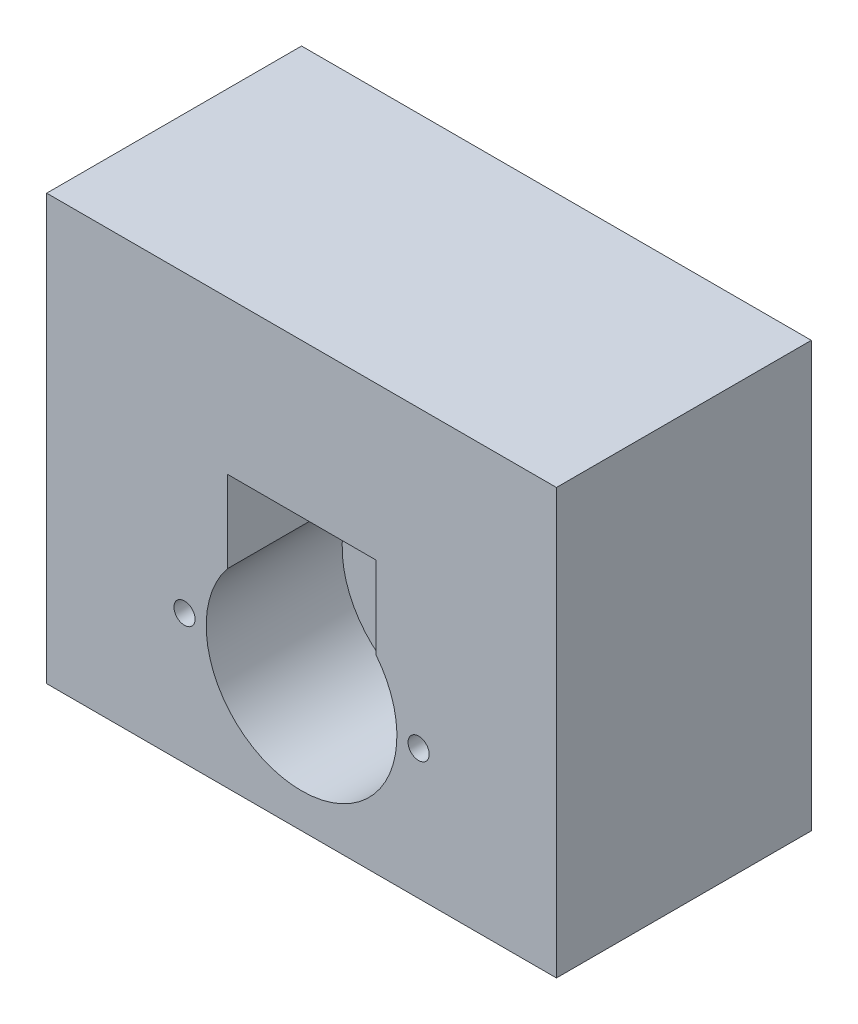
ISO-10303-21;
HEADER;
FILE_DESCRIPTION(('STEP AP214'),'2;1');
FILE_NAME('part.step','',(''),(''),'','','');
FILE_SCHEMA(('AUTOMOTIVE_DESIGN { 1 0 10303 214 1 1 1 1 }'));
ENDSEC;
DATA;
#1=APPLICATION_CONTEXT('core data for automotive mechanical design processes');
#2=APPLICATION_PROTOCOL_DEFINITION('international standard','automotive_design',2000,#1);
#3=PRODUCT_CONTEXT('',#1,'mechanical');
#4=PRODUCT('Part','Part','',(#3));
#5=PRODUCT_RELATED_PRODUCT_CATEGORY('part','',(#4));
#6=PRODUCT_DEFINITION_FORMATION('','',#4);
#7=PRODUCT_DEFINITION_CONTEXT('part definition',#1,'design');
#8=PRODUCT_DEFINITION('design','',#6,#7);
#9=PRODUCT_DEFINITION_SHAPE('','',#8);
#10=(LENGTH_UNIT() NAMED_UNIT(*) SI_UNIT(.MILLI.,.METRE.));
#11=(NAMED_UNIT(*) PLANE_ANGLE_UNIT() SI_UNIT($,.RADIAN.));
#12=(NAMED_UNIT(*) SI_UNIT($,.STERADIAN.) SOLID_ANGLE_UNIT());
#13=UNCERTAINTY_MEASURE_WITH_UNIT(LENGTH_MEASURE(1.E-05),#10,'distance_accuracy_value','');
#14=(GEOMETRIC_REPRESENTATION_CONTEXT(3) GLOBAL_UNCERTAINTY_ASSIGNED_CONTEXT((#13)) GLOBAL_UNIT_ASSIGNED_CONTEXT((#10,
#11,#12)) REPRESENTATION_CONTEXT('',''));
#15=CARTESIAN_POINT('',(0.,0.,0.));
#16=DIRECTION('',(0.,0.,1.));
#17=DIRECTION('',(1.,0.,0.));
#18=AXIS2_PLACEMENT_3D('',#15,#16,#17);
#19=CARTESIAN_POINT('',(0.,0.,38.1));
#20=DIRECTION('',(0.,0.,1.));
#21=DIRECTION('',(1.,0.,0.));
#22=AXIS2_PLACEMENT_3D('',#19,#20,#21);
#23=PLANE('',#22);
#24=CARTESIAN_POINT('',(17.5000000000005,-12.3156200112198,38.1));
#25=DIRECTION('',(0.,0.,1.));
#26=DIRECTION('',(1.,0.,0.));
#27=AXIS2_PLACEMENT_3D('',#24,#25,#26);
#28=CIRCLE('',#27,1.57999999999947);
#29=CARTESIAN_POINT('',(19.0799999999999,-12.3156200112198,38.1));
#30=VERTEX_POINT('',#29);
#31=EDGE_CURVE('E225',#30,#30,#28,.T.);
#32=ORIENTED_EDGE('',*,*,#31,.F.);
#33=EDGE_LOOP('',(#32));
#34=FACE_BOUND('',#33,.T.);
#35=CARTESIAN_POINT('',(-17.4999999999996,-12.3156200112198,38.1));
#36=DIRECTION('',(0.,0.,1.));
#37=DIRECTION('',(1.,0.,0.));
#38=AXIS2_PLACEMENT_3D('',#35,#36,#37);
#39=CIRCLE('',#38,1.57999999999947);
#40=CARTESIAN_POINT('',(-15.9200000000001,-12.3156200112198,38.1));
#41=VERTEX_POINT('',#40);
#42=EDGE_CURVE('E229',#41,#41,#39,.T.);
#43=ORIENTED_EDGE('',*,*,#42,.F.);
#44=EDGE_LOOP('',(#43));
#45=FACE_BOUND('',#44,.T.);
#46=DIRECTION('',(0.,-1.,0.));
#47=VECTOR('',#46,1.);
#48=CARTESIAN_POINT('',(-38.1,-31.75,38.1));
#49=LINE('',#48,#47);
#50=CARTESIAN_POINT('',(-38.1,31.75,38.1));
#51=VERTEX_POINT('',#50);
#52=CARTESIAN_POINT('',(-38.1,-31.75,38.1));
#53=VERTEX_POINT('',#52);
#54=EDGE_CURVE('E147',#51,#53,#49,.T.);
#55=ORIENTED_EDGE('',*,*,#54,.T.);
#56=DIRECTION('',(1.,0.,0.));
#57=VECTOR('',#56,1.);
#58=CARTESIAN_POINT('',(38.1,-31.75,38.1));
#59=LINE('',#58,#57);
#60=CARTESIAN_POINT('',(38.1,-31.75,38.1));
#61=VERTEX_POINT('',#60);
#62=EDGE_CURVE('E94',#53,#61,#59,.T.);
#63=ORIENTED_EDGE('',*,*,#62,.T.);
#64=DIRECTION('',(0.,1.,0.));
#65=VECTOR('',#64,1.);
#66=CARTESIAN_POINT('',(38.1,-31.75,38.1));
#67=LINE('',#66,#65);
#68=CARTESIAN_POINT('',(38.1,31.75,38.1));
#69=VERTEX_POINT('',#68);
#70=EDGE_CURVE('E150',#61,#69,#67,.T.);
#71=ORIENTED_EDGE('',*,*,#70,.T.);
#72=DIRECTION('',(-1.,0.,0.));
#73=VECTOR('',#72,1.);
#74=CARTESIAN_POINT('',(38.1,31.75,38.1));
#75=LINE('',#74,#73);
#76=EDGE_CURVE('E66',#69,#51,#75,.T.);
#77=ORIENTED_EDGE('',*,*,#76,.T.);
#78=EDGE_LOOP('',(#55,#63,#71,#77));
#79=FACE_BOUND('',#78,.T.);
#80=CARTESIAN_POINT('',(0.,-12.3156200112199,38.1));
#81=DIRECTION('',(0.,0.,1.));
#82=DIRECTION('',(1.,0.,0.));
#83=AXIS2_PLACEMENT_3D('',#80,#81,#82);
#84=CIRCLE('',#83,14.25399994);
#85=CARTESIAN_POINT('',(-11.0954170712053,-3.36753450059093,38.1));
#86=VERTEX_POINT('',#85);
#87=CARTESIAN_POINT('',(11.0954170712052,-3.36753450059093,38.1));
#88=VERTEX_POINT('',#87);
#89=EDGE_CURVE('E132',#86,#88,#84,.T.);
#90=ORIENTED_EDGE('',*,*,#89,.F.);
#91=DIRECTION('',(0.,1.,0.));
#92=VECTOR('',#91,1.);
#93=CARTESIAN_POINT('',(-11.0954170712053,-3.36753450059093,38.1));
#94=LINE('',#93,#92);
#95=CARTESIAN_POINT('',(-11.0954170712053,8.87092032554276,38.1));
#96=VERTEX_POINT('',#95);
#97=EDGE_CURVE('E57',#86,#96,#94,.T.);
#98=ORIENTED_EDGE('',*,*,#97,.T.);
#99=DIRECTION('',(1.,0.,0.));
#100=VECTOR('',#99,1.);
#101=CARTESIAN_POINT('',(-11.0954170712053,8.87092032554276,38.1));
#102=LINE('',#101,#100);
#103=CARTESIAN_POINT('',(11.0954170712052,8.87092032554276,38.1));
#104=VERTEX_POINT('',#103);
#105=EDGE_CURVE('E136',#96,#104,#102,.T.);
#106=ORIENTED_EDGE('',*,*,#105,.T.);
#107=DIRECTION('',(0.,1.,0.));
#108=VECTOR('',#107,1.);
#109=CARTESIAN_POINT('',(11.0954170712052,-3.36753450059093,38.1));
#110=LINE('',#109,#108);
#111=EDGE_CURVE('E241',#88,#104,#110,.T.);
#112=ORIENTED_EDGE('',*,*,#111,.F.);
#113=EDGE_LOOP('',(#90,#98,#106,#112));
#114=FACE_BOUND('',#113,.T.);
#115=ADVANCED_FACE('F42',(#34,#45,#79,#114),#23,.T.);
#116=CARTESIAN_POINT('',(-38.1,-31.75,38.1));
#117=DIRECTION('',(1.,0.,0.));
#118=DIRECTION('',(0.,0.,-1.));
#119=AXIS2_PLACEMENT_3D('',#116,#117,#118);
#120=PLANE('',#119);
#121=DIRECTION('',(0.,-1.,0.));
#122=VECTOR('',#121,1.);
#123=CARTESIAN_POINT('',(-38.1,-31.75,0.));
#124=LINE('',#123,#122);
#125=CARTESIAN_POINT('',(-38.1,31.75,0.));
#126=VERTEX_POINT('',#125);
#127=CARTESIAN_POINT('',(-38.1,-31.75,0.));
#128=VERTEX_POINT('',#127);
#129=EDGE_CURVE('E137',#126,#128,#124,.T.);
#130=ORIENTED_EDGE('',*,*,#129,.T.);
#131=DIRECTION('',(0.,0.,-1.));
#132=VECTOR('',#131,1.);
#133=CARTESIAN_POINT('',(-38.1,-31.75,38.1));
#134=LINE('',#133,#132);
#135=EDGE_CURVE('E11',#53,#128,#134,.T.);
#136=ORIENTED_EDGE('',*,*,#135,.F.);
#137=ORIENTED_EDGE('',*,*,#54,.F.);
#138=DIRECTION('',(0.,0.,-1.));
#139=VECTOR('',#138,1.);
#140=CARTESIAN_POINT('',(-38.1,31.75,38.1));
#141=LINE('',#140,#139);
#142=EDGE_CURVE('E152',#51,#126,#141,.T.);
#143=ORIENTED_EDGE('',*,*,#142,.T.);
#144=EDGE_LOOP('',(#130,#136,#137,#143));
#145=FACE_BOUND('',#144,.T.);
#146=ADVANCED_FACE('F44',(#145),#120,.F.);
#147=CARTESIAN_POINT('',(38.1,-31.75,38.1));
#148=DIRECTION('',(0.,1.,0.));
#149=DIRECTION('',(-1.,0.,0.));
#150=AXIS2_PLACEMENT_3D('',#147,#148,#149);
#151=PLANE('',#150);
#152=DIRECTION('',(1.,0.,0.));
#153=VECTOR('',#152,1.);
#154=CARTESIAN_POINT('',(38.1,-31.75,0.));
#155=LINE('',#154,#153);
#156=CARTESIAN_POINT('',(38.1,-31.75,0.));
#157=VERTEX_POINT('',#156);
#158=EDGE_CURVE('E141',#128,#157,#155,.T.);
#159=ORIENTED_EDGE('',*,*,#158,.T.);
#160=DIRECTION('',(0.,0.,-1.));
#161=VECTOR('',#160,1.);
#162=CARTESIAN_POINT('',(38.1,-31.75,38.1));
#163=LINE('',#162,#161);
#164=EDGE_CURVE('E50',#61,#157,#163,.T.);
#165=ORIENTED_EDGE('',*,*,#164,.F.);
#166=ORIENTED_EDGE('',*,*,#62,.F.);
#167=ORIENTED_EDGE('',*,*,#135,.T.);
#168=EDGE_LOOP('',(#159,#165,#166,#167));
#169=FACE_BOUND('',#168,.T.);
#170=ADVANCED_FACE('F180',(#169),#151,.F.);
#171=CARTESIAN_POINT('',(38.1,-31.75,38.1));
#172=DIRECTION('',(-1.,0.,0.));
#173=DIRECTION('',(0.,0.,1.));
#174=AXIS2_PLACEMENT_3D('',#171,#172,#173);
#175=PLANE('',#174);
#176=DIRECTION('',(0.,1.,0.));
#177=VECTOR('',#176,1.);
#178=CARTESIAN_POINT('',(38.1,-31.75,0.));
#179=LINE('',#178,#177);
#180=CARTESIAN_POINT('',(38.1,31.75,0.));
#181=VERTEX_POINT('',#180);
#182=EDGE_CURVE('E155',#157,#181,#179,.T.);
#183=ORIENTED_EDGE('',*,*,#182,.T.);
#184=DIRECTION('',(0.,0.,-1.));
#185=VECTOR('',#184,1.);
#186=CARTESIAN_POINT('',(38.1,31.75,38.1));
#187=LINE('',#186,#185);
#188=EDGE_CURVE('E159',#69,#181,#187,.T.);
#189=ORIENTED_EDGE('',*,*,#188,.F.);
#190=ORIENTED_EDGE('',*,*,#70,.F.);
#191=ORIENTED_EDGE('',*,*,#164,.T.);
#192=EDGE_LOOP('',(#183,#189,#190,#191));
#193=FACE_BOUND('',#192,.T.);
#194=ADVANCED_FACE('F164',(#193),#175,.F.);
#195=CARTESIAN_POINT('',(38.1,31.75,38.1));
#196=DIRECTION('',(0.,-1.,0.));
#197=DIRECTION('',(1.,0.,0.));
#198=AXIS2_PLACEMENT_3D('',#195,#196,#197);
#199=PLANE('',#198);
#200=DIRECTION('',(-1.,0.,0.));
#201=VECTOR('',#200,1.);
#202=CARTESIAN_POINT('',(38.1,31.75,0.));
#203=LINE('',#202,#201);
#204=EDGE_CURVE('E87',#181,#126,#203,.T.);
#205=ORIENTED_EDGE('',*,*,#204,.T.);
#206=ORIENTED_EDGE('',*,*,#142,.F.);
#207=ORIENTED_EDGE('',*,*,#76,.F.);
#208=ORIENTED_EDGE('',*,*,#188,.T.);
#209=EDGE_LOOP('',(#205,#206,#207,#208));
#210=FACE_BOUND('',#209,.T.);
#211=ADVANCED_FACE('F172',(#210),#199,.F.);
#212=CARTESIAN_POINT('',(0.,0.,0.));
#213=DIRECTION('',(0.,0.,1.));
#214=DIRECTION('',(1.,0.,0.));
#215=AXIS2_PLACEMENT_3D('',#212,#213,#214);
#216=PLANE('',#215);
#217=ORIENTED_EDGE('',*,*,#129,.F.);
#218=ORIENTED_EDGE('',*,*,#204,.F.);
#219=ORIENTED_EDGE('',*,*,#182,.F.);
#220=ORIENTED_EDGE('',*,*,#158,.F.);
#221=EDGE_LOOP('',(#217,#218,#219,#220));
#222=FACE_BOUND('',#221,.T.);
#223=ADVANCED_FACE('F168',(#222),#216,.F.);
#224=CARTESIAN_POINT('',(-11.0954170712053,-3.36753450059093,17.78));
#225=DIRECTION('',(1.,0.,0.));
#226=DIRECTION('',(0.,0.,-1.));
#227=AXIS2_PLACEMENT_3D('',#224,#225,#226);
#228=PLANE('',#227);
#229=ORIENTED_EDGE('',*,*,#97,.F.);
#230=DIRECTION('',(0.,0.,1.));
#231=VECTOR('',#230,1.);
#232=CARTESIAN_POINT('',(-11.0954170712053,-3.36753450059093,17.78));
#233=LINE('',#232,#231);
#234=CARTESIAN_POINT('',(-11.0954170712053,-3.36753450059093,17.78));
#235=VERTEX_POINT('',#234);
#236=EDGE_CURVE('E131',#235,#86,#233,.T.);
#237=ORIENTED_EDGE('',*,*,#236,.F.);
#238=DIRECTION('',(0.,1.,0.));
#239=VECTOR('',#238,1.);
#240=CARTESIAN_POINT('',(-11.0954170712053,-3.36753450059093,17.78));
#241=LINE('',#240,#239);
#242=CARTESIAN_POINT('',(-11.0954170712053,8.87092032554276,17.78));
#243=VERTEX_POINT('',#242);
#244=EDGE_CURVE('E121',#235,#243,#241,.T.);
#245=ORIENTED_EDGE('',*,*,#244,.T.);
#246=DIRECTION('',(0.,0.,1.));
#247=VECTOR('',#246,1.);
#248=CARTESIAN_POINT('',(-11.0954170712053,8.87092032554276,17.78));
#249=LINE('',#248,#247);
#250=EDGE_CURVE('E130',#243,#96,#249,.T.);
#251=ORIENTED_EDGE('',*,*,#250,.T.);
#252=EDGE_LOOP('',(#229,#237,#245,#251));
#253=FACE_BOUND('',#252,.T.);
#254=ADVANCED_FACE('F129',(#253),#228,.T.);
#255=CARTESIAN_POINT('',(-11.0954170712053,8.87092032554276,17.78));
#256=DIRECTION('',(0.,-1.,0.));
#257=DIRECTION('',(0.,0.,-1.));
#258=AXIS2_PLACEMENT_3D('',#255,#256,#257);
#259=PLANE('',#258);
#260=ORIENTED_EDGE('',*,*,#105,.F.);
#261=ORIENTED_EDGE('',*,*,#250,.F.);
#262=DIRECTION('',(1.,0.,0.));
#263=VECTOR('',#262,1.);
#264=CARTESIAN_POINT('',(-11.0954170712053,8.87092032554276,17.78));
#265=LINE('',#264,#263);
#266=CARTESIAN_POINT('',(11.0954170712052,8.87092032554276,17.78));
#267=VERTEX_POINT('',#266);
#268=EDGE_CURVE('E117',#243,#267,#265,.T.);
#269=ORIENTED_EDGE('',*,*,#268,.T.);
#270=DIRECTION('',(0.,0.,1.));
#271=VECTOR('',#270,1.);
#272=CARTESIAN_POINT('',(11.0954170712052,8.87092032554276,17.78));
#273=LINE('',#272,#271);
#274=EDGE_CURVE('E138',#267,#104,#273,.T.);
#275=ORIENTED_EDGE('',*,*,#274,.T.);
#276=EDGE_LOOP('',(#260,#261,#269,#275));
#277=FACE_BOUND('',#276,.T.);
#278=ADVANCED_FACE('F134',(#277),#259,.T.);
#279=CARTESIAN_POINT('',(11.0954170712052,-3.36753450059093,17.78));
#280=DIRECTION('',(1.,0.,0.));
#281=DIRECTION('',(0.,0.,-1.));
#282=AXIS2_PLACEMENT_3D('',#279,#280,#281);
#283=PLANE('',#282);
#284=ORIENTED_EDGE('',*,*,#111,.T.);
#285=ORIENTED_EDGE('',*,*,#274,.F.);
#286=DIRECTION('',(0.,1.,0.));
#287=VECTOR('',#286,1.);
#288=CARTESIAN_POINT('',(11.0954170712052,-3.36753450059093,17.78));
#289=LINE('',#288,#287);
#290=CARTESIAN_POINT('',(11.0954170712052,-3.36753450059093,17.78));
#291=VERTEX_POINT('',#290);
#292=EDGE_CURVE('E124',#291,#267,#289,.T.);
#293=ORIENTED_EDGE('',*,*,#292,.F.);
#294=DIRECTION('',(0.,0.,1.));
#295=VECTOR('',#294,1.);
#296=CARTESIAN_POINT('',(11.0954170712052,-3.36753450059093,17.78));
#297=LINE('',#296,#295);
#298=EDGE_CURVE('E143',#291,#88,#297,.T.);
#299=ORIENTED_EDGE('',*,*,#298,.T.);
#300=EDGE_LOOP('',(#284,#285,#293,#299));
#301=FACE_BOUND('',#300,.T.);
#302=ADVANCED_FACE('F197',(#301),#283,.F.);
#303=CARTESIAN_POINT('',(0.,-12.3156200112199,17.78));
#304=DIRECTION('',(0.,0.,1.));
#305=DIRECTION('',(1.,0.,0.));
#306=AXIS2_PLACEMENT_3D('',#303,#304,#305);
#307=CYLINDRICAL_SURFACE('',#306,14.25399994);
#308=ORIENTED_EDGE('',*,*,#89,.T.);
#309=ORIENTED_EDGE('',*,*,#298,.F.);
#310=CARTESIAN_POINT('',(0.,-12.3156200112199,17.78));
#311=DIRECTION('',(0.,0.,1.));
#312=DIRECTION('',(1.,0.,0.));
#313=AXIS2_PLACEMENT_3D('',#310,#311,#312);
#314=CIRCLE('',#313,14.25399994);
#315=EDGE_CURVE('E238',#235,#291,#314,.T.);
#316=ORIENTED_EDGE('',*,*,#315,.F.);
#317=ORIENTED_EDGE('',*,*,#236,.T.);
#318=EDGE_LOOP('',(#308,#309,#316,#317));
#319=FACE_BOUND('',#318,.T.);
#320=ADVANCED_FACE('F200',(#319),#307,.F.);
#321=CARTESIAN_POINT('',(0.,-12.3156200112199,17.78));
#322=DIRECTION('',(0.,0.,1.));
#323=DIRECTION('',(1.,0.,0.));
#324=AXIS2_PLACEMENT_3D('',#321,#322,#323);
#325=PLANE('',#324);
#326=ORIENTED_EDGE('',*,*,#244,.F.);
#327=ORIENTED_EDGE('',*,*,#315,.T.);
#328=ORIENTED_EDGE('',*,*,#292,.T.);
#329=ORIENTED_EDGE('',*,*,#268,.F.);
#330=EDGE_LOOP('',(#326,#327,#328,#329));
#331=FACE_BOUND('',#330,.T.);
#332=ADVANCED_FACE('F119',(#331),#325,.T.);
#333=CARTESIAN_POINT('',(-17.4999999999996,-12.3156200112198,17.78));
#334=DIRECTION('',(0.,0.,1.));
#335=DIRECTION('',(1.,0.,0.));
#336=AXIS2_PLACEMENT_3D('',#333,#334,#335);
#337=CYLINDRICAL_SURFACE('',#336,1.57999999999947);
#338=CARTESIAN_POINT('',(-17.4999999999996,-12.3156200112198,17.78));
#339=DIRECTION('',(0.,0.,1.));
#340=DIRECTION('',(1.,0.,0.));
#341=AXIS2_PLACEMENT_3D('',#338,#339,#340);
#342=CIRCLE('',#341,1.57999999999947);
#343=CARTESIAN_POINT('',(-15.9200000000001,-12.3156200112198,17.78));
#344=VERTEX_POINT('',#343);
#345=EDGE_CURVE('E234',#344,#344,#342,.T.);
#346=ORIENTED_EDGE('',*,*,#345,.F.);
#347=EDGE_LOOP('',(#346));
#348=FACE_BOUND('',#347,.T.);
#349=ORIENTED_EDGE('',*,*,#42,.T.);
#350=EDGE_LOOP('',(#349));
#351=FACE_BOUND('',#350,.T.);
#352=ADVANCED_FACE('F206',(#348,#351),#337,.F.);
#353=CARTESIAN_POINT('',(-17.4999999999996,-12.3156200112198,17.78));
#354=DIRECTION('',(0.,0.,1.));
#355=DIRECTION('',(1.,0.,0.));
#356=AXIS2_PLACEMENT_3D('',#353,#354,#355);
#357=PLANE('',#356);
#358=ORIENTED_EDGE('',*,*,#345,.T.);
#359=EDGE_LOOP('',(#358));
#360=FACE_BOUND('',#359,.T.);
#361=ADVANCED_FACE('F207',(#360),#357,.T.);
#362=CARTESIAN_POINT('',(17.5000000000005,-12.3156200112198,17.78));
#363=DIRECTION('',(0.,0.,1.));
#364=DIRECTION('',(1.,0.,0.));
#365=AXIS2_PLACEMENT_3D('',#362,#363,#364);
#366=CYLINDRICAL_SURFACE('',#365,1.57999999999947);
#367=CARTESIAN_POINT('',(17.5000000000005,-12.3156200112198,17.78));
#368=DIRECTION('',(0.,0.,1.));
#369=DIRECTION('',(1.,0.,0.));
#370=AXIS2_PLACEMENT_3D('',#367,#368,#369);
#371=CIRCLE('',#370,1.57999999999947);
#372=CARTESIAN_POINT('',(19.0799999999999,-12.3156200112198,17.78));
#373=VERTEX_POINT('',#372);
#374=EDGE_CURVE('E224',#373,#373,#371,.T.);
#375=ORIENTED_EDGE('',*,*,#374,.F.);
#376=EDGE_LOOP('',(#375));
#377=FACE_BOUND('',#376,.T.);
#378=ORIENTED_EDGE('',*,*,#31,.T.);
#379=EDGE_LOOP('',(#378));
#380=FACE_BOUND('',#379,.T.);
#381=ADVANCED_FACE('F210',(#377,#380),#366,.F.);
#382=CARTESIAN_POINT('',(17.5000000000005,-12.3156200112198,17.78));
#383=DIRECTION('',(0.,0.,1.));
#384=DIRECTION('',(1.,0.,0.));
#385=AXIS2_PLACEMENT_3D('',#382,#383,#384);
#386=PLANE('',#385);
#387=ORIENTED_EDGE('',*,*,#374,.T.);
#388=EDGE_LOOP('',(#387));
#389=FACE_BOUND('',#388,.T.);
#390=ADVANCED_FACE('F216',(#389),#386,.T.);
#391=CLOSED_SHELL('',(#115,#146,#170,#194,#211,#223,#254,#278,#302,#320,#332,#352,#361,#381,#390));
#392=MANIFOLD_SOLID_BREP('B2',#391);
#393=ADVANCED_BREP_SHAPE_REPRESENTATION('',(#18,#392),#14);
#394=SHAPE_DEFINITION_REPRESENTATION(#9,#393);
ENDSEC;
END-ISO-10303-21;
